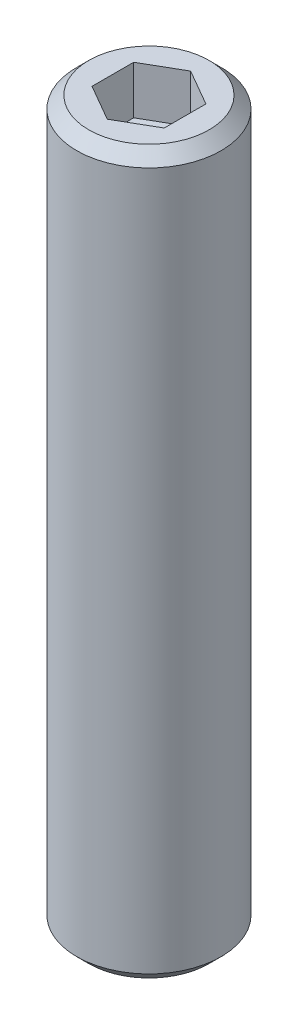
ISO-10303-21;
HEADER;
FILE_DESCRIPTION(('STEP AP214'),'2;1');
FILE_NAME('part.step','',(''),(''),'','','');
FILE_SCHEMA(('AUTOMOTIVE_DESIGN { 1 0 10303 214 1 1 1 1 }'));
ENDSEC;
DATA;
#1=APPLICATION_CONTEXT('core data for automotive mechanical design processes');
#2=APPLICATION_PROTOCOL_DEFINITION('international standard','automotive_design',2000,#1);
#3=PRODUCT_CONTEXT('',#1,'mechanical');
#4=PRODUCT('Part','Part','',(#3));
#5=PRODUCT_RELATED_PRODUCT_CATEGORY('part','',(#4));
#6=PRODUCT_DEFINITION_FORMATION('','',#4);
#7=PRODUCT_DEFINITION_CONTEXT('part definition',#1,'design');
#8=PRODUCT_DEFINITION('design','',#6,#7);
#9=PRODUCT_DEFINITION_SHAPE('','',#8);
#10=(LENGTH_UNIT() NAMED_UNIT(*) SI_UNIT(.MILLI.,.METRE.));
#11=(NAMED_UNIT(*) PLANE_ANGLE_UNIT() SI_UNIT($,.RADIAN.));
#12=(NAMED_UNIT(*) SI_UNIT($,.STERADIAN.) SOLID_ANGLE_UNIT());
#13=UNCERTAINTY_MEASURE_WITH_UNIT(LENGTH_MEASURE(1.E-05),#10,'distance_accuracy_value','');
#14=(GEOMETRIC_REPRESENTATION_CONTEXT(3) GLOBAL_UNCERTAINTY_ASSIGNED_CONTEXT((#13)) GLOBAL_UNIT_ASSIGNED_CONTEXT((#10,
#11,#12)) REPRESENTATION_CONTEXT('',''));
#15=CARTESIAN_POINT('',(0.,0.,0.));
#16=DIRECTION('',(0.,0.,1.));
#17=DIRECTION('',(1.,0.,0.));
#18=AXIS2_PLACEMENT_3D('',#15,#16,#17);
#19=CARTESIAN_POINT('',(0.,-30.,0.));
#20=DIRECTION('',(0.,1.,0.));
#21=DIRECTION('',(0.,0.,1.));
#22=AXIS2_PLACEMENT_3D('',#19,#20,#21);
#23=CYLINDRICAL_SURFACE('',#22,3.);
#24=CARTESIAN_POINT('',(0.,-29.5,0.));
#25=DIRECTION('',(0.,1.,0.));
#26=DIRECTION('',(0.,0.,1.));
#27=AXIS2_PLACEMENT_3D('',#24,#25,#26);
#28=CIRCLE('',#27,3.);
#29=CARTESIAN_POINT('',(0.,-29.5,3.));
#30=VERTEX_POINT('',#29);
#31=EDGE_CURVE('E144',#30,#30,#28,.T.);
#32=ORIENTED_EDGE('',*,*,#31,.T.);
#33=EDGE_LOOP('',(#32));
#34=FACE_BOUND('',#33,.T.);
#35=CARTESIAN_POINT('',(0.,-0.500000000000007,0.));
#36=DIRECTION('',(0.,1.,0.));
#37=DIRECTION('',(0.,0.,1.));
#38=AXIS2_PLACEMENT_3D('',#35,#36,#37);
#39=CIRCLE('',#38,3.);
#40=CARTESIAN_POINT('',(0.,-0.500000000000007,3.));
#41=VERTEX_POINT('',#40);
#42=EDGE_CURVE('E136',#41,#41,#39,.F.);
#43=ORIENTED_EDGE('',*,*,#42,.T.);
#44=EDGE_LOOP('',(#43));
#45=FACE_BOUND('',#44,.T.);
#46=ADVANCED_FACE('F34',(#34,#45),#23,.T.);
#47=CARTESIAN_POINT('',(0.,-30.,0.));
#48=DIRECTION('',(0.,1.,0.));
#49=DIRECTION('',(0.,0.,1.));
#50=AXIS2_PLACEMENT_3D('',#47,#48,#49);
#51=PLANE('',#50);
#52=CARTESIAN_POINT('',(0.,-30.,0.));
#53=DIRECTION('',(0.,1.,0.));
#54=DIRECTION('',(0.,0.,1.));
#55=AXIS2_PLACEMENT_3D('',#52,#53,#54);
#56=CIRCLE('',#55,2.49999999999999);
#57=CARTESIAN_POINT('',(0.,-30.,2.49999999999999));
#58=VERTEX_POINT('',#57);
#59=EDGE_CURVE('E42',#58,#58,#56,.F.);
#60=ORIENTED_EDGE('',*,*,#59,.T.);
#61=EDGE_LOOP('',(#60));
#62=FACE_BOUND('',#61,.T.);
#63=ADVANCED_FACE('F149',(#62),#51,.F.);
#64=CARTESIAN_POINT('',(0.,0.,0.));
#65=DIRECTION('',(0.,1.,0.));
#66=DIRECTION('',(0.,0.,1.));
#67=AXIS2_PLACEMENT_3D('',#64,#65,#66);
#68=PLANE('',#67);
#69=CARTESIAN_POINT('',(0.,0.,0.));
#70=DIRECTION('',(0.,1.,0.));
#71=DIRECTION('',(0.,0.,1.));
#72=AXIS2_PLACEMENT_3D('',#69,#70,#71);
#73=CIRCLE('',#72,2.5);
#74=CARTESIAN_POINT('',(0.,0.,2.5));
#75=VERTEX_POINT('',#74);
#76=EDGE_CURVE('E11',#75,#75,#73,.T.);
#77=ORIENTED_EDGE('',*,*,#76,.T.);
#78=EDGE_LOOP('',(#77));
#79=FACE_BOUND('',#78,.T.);
#80=DIRECTION('',(-0.866025403784439,0.,-0.5));
#81=VECTOR('',#80,1.);
#82=CARTESIAN_POINT('',(1.5,0.,-0.86602540378444));
#83=LINE('',#82,#81);
#84=CARTESIAN_POINT('',(1.5,0.,-0.86602540378444));
#85=VERTEX_POINT('',#84);
#86=CARTESIAN_POINT('',(0.,0.,-1.73205080756888));
#87=VERTEX_POINT('',#86);
#88=EDGE_CURVE('E49',#85,#87,#83,.T.);
#89=ORIENTED_EDGE('',*,*,#88,.F.);
#90=DIRECTION('',(0.,0.,-1.));
#91=VECTOR('',#90,1.);
#92=CARTESIAN_POINT('',(1.5,0.,0.866025403784438));
#93=LINE('',#92,#91);
#94=CARTESIAN_POINT('',(1.5,0.,0.866025403784438));
#95=VERTEX_POINT('',#94);
#96=EDGE_CURVE('E132',#95,#85,#93,.T.);
#97=ORIENTED_EDGE('',*,*,#96,.F.);
#98=DIRECTION('',(0.866025403784439,0.,-0.5));
#99=VECTOR('',#98,1.);
#100=CARTESIAN_POINT('',(0.,0.,1.73205080756888));
#101=LINE('',#100,#99);
#102=CARTESIAN_POINT('',(0.,0.,1.73205080756888));
#103=VERTEX_POINT('',#102);
#104=EDGE_CURVE('E130',#103,#95,#101,.T.);
#105=ORIENTED_EDGE('',*,*,#104,.F.);
#106=DIRECTION('',(0.866025403784439,0.,0.5));
#107=VECTOR('',#106,1.);
#108=CARTESIAN_POINT('',(-1.5,0.,0.866025403784439));
#109=LINE('',#108,#107);
#110=CARTESIAN_POINT('',(-1.5,0.,0.866025403784439));
#111=VERTEX_POINT('',#110);
#112=EDGE_CURVE('E97',#111,#103,#109,.T.);
#113=ORIENTED_EDGE('',*,*,#112,.F.);
#114=DIRECTION('',(0.,0.,1.));
#115=VECTOR('',#114,1.);
#116=CARTESIAN_POINT('',(-1.5,0.,-0.866025403784439));
#117=LINE('',#116,#115);
#118=CARTESIAN_POINT('',(-1.5,0.,-0.866025403784439));
#119=VERTEX_POINT('',#118);
#120=EDGE_CURVE('E126',#119,#111,#117,.T.);
#121=ORIENTED_EDGE('',*,*,#120,.F.);
#122=DIRECTION('',(-0.866025403784438,0.,0.5));
#123=VECTOR('',#122,1.);
#124=CARTESIAN_POINT('',(0.,0.,-1.73205080756888));
#125=LINE('',#124,#123);
#126=EDGE_CURVE('E123',#87,#119,#125,.T.);
#127=ORIENTED_EDGE('',*,*,#126,.F.);
#128=EDGE_LOOP('',(#89,#97,#105,#113,#121,#127));
#129=FACE_BOUND('',#128,.T.);
#130=ADVANCED_FACE('F165',(#79,#129),#68,.T.);
#131=CARTESIAN_POINT('',(1.5,-2.,-0.86602540378444));
#132=DIRECTION('',(0.5,0.,-0.866025403784439));
#133=DIRECTION('',(-0.866025403784439,0.,-0.5));
#134=AXIS2_PLACEMENT_3D('',#131,#132,#133);
#135=PLANE('',#134);
#136=ORIENTED_EDGE('',*,*,#88,.T.);
#137=DIRECTION('',(0.,1.,0.));
#138=VECTOR('',#137,1.);
#139=CARTESIAN_POINT('',(0.,-2.,-1.73205080756888));
#140=LINE('',#139,#138);
#141=CARTESIAN_POINT('',(0.,-2.,-1.73205080756888));
#142=VERTEX_POINT('',#141);
#143=EDGE_CURVE('E79',#142,#87,#140,.T.);
#144=ORIENTED_EDGE('',*,*,#143,.F.);
#145=DIRECTION('',(-0.866025403784439,0.,-0.5));
#146=VECTOR('',#145,1.);
#147=CARTESIAN_POINT('',(1.5,-2.,-0.86602540378444));
#148=LINE('',#147,#146);
#149=CARTESIAN_POINT('',(1.5,-2.,-0.86602540378444));
#150=VERTEX_POINT('',#149);
#151=EDGE_CURVE('E134',#150,#142,#148,.T.);
#152=ORIENTED_EDGE('',*,*,#151,.F.);
#153=DIRECTION('',(0.,1.,0.));
#154=VECTOR('',#153,1.);
#155=CARTESIAN_POINT('',(1.5,-2.,-0.86602540378444));
#156=LINE('',#155,#154);
#157=EDGE_CURVE('E57',#150,#85,#156,.T.);
#158=ORIENTED_EDGE('',*,*,#157,.T.);
#159=EDGE_LOOP('',(#136,#144,#152,#158));
#160=FACE_BOUND('',#159,.T.);
#161=ADVANCED_FACE('F168',(#160),#135,.F.);
#162=CARTESIAN_POINT('',(1.5,-2.,0.866025403784438));
#163=DIRECTION('',(1.,0.,0.));
#164=DIRECTION('',(0.,0.,-1.));
#165=AXIS2_PLACEMENT_3D('',#162,#163,#164);
#166=PLANE('',#165);
#167=ORIENTED_EDGE('',*,*,#96,.T.);
#168=ORIENTED_EDGE('',*,*,#157,.F.);
#169=DIRECTION('',(0.,0.,-1.));
#170=VECTOR('',#169,1.);
#171=CARTESIAN_POINT('',(1.5,-2.,0.866025403784438));
#172=LINE('',#171,#170);
#173=CARTESIAN_POINT('',(1.5,-2.,0.866025403784438));
#174=VERTEX_POINT('',#173);
#175=EDGE_CURVE('E109',#174,#150,#172,.T.);
#176=ORIENTED_EDGE('',*,*,#175,.F.);
#177=DIRECTION('',(0.,1.,0.));
#178=VECTOR('',#177,1.);
#179=CARTESIAN_POINT('',(1.5,-2.,0.866025403784438));
#180=LINE('',#179,#178);
#181=EDGE_CURVE('E101',#174,#95,#180,.T.);
#182=ORIENTED_EDGE('',*,*,#181,.T.);
#183=EDGE_LOOP('',(#167,#168,#176,#182));
#184=FACE_BOUND('',#183,.T.);
#185=ADVANCED_FACE('F177',(#184),#166,.F.);
#186=CARTESIAN_POINT('',(0.,-2.,1.73205080756888));
#187=DIRECTION('',(0.5,0.,0.866025403784439));
#188=DIRECTION('',(0.866025403784439,0.,-0.5));
#189=AXIS2_PLACEMENT_3D('',#186,#187,#188);
#190=PLANE('',#189);
#191=ORIENTED_EDGE('',*,*,#104,.T.);
#192=ORIENTED_EDGE('',*,*,#181,.F.);
#193=DIRECTION('',(0.866025403784439,0.,-0.5));
#194=VECTOR('',#193,1.);
#195=CARTESIAN_POINT('',(0.,-2.,1.73205080756888));
#196=LINE('',#195,#194);
#197=CARTESIAN_POINT('',(0.,-2.,1.73205080756888));
#198=VERTEX_POINT('',#197);
#199=EDGE_CURVE('E105',#198,#174,#196,.T.);
#200=ORIENTED_EDGE('',*,*,#199,.F.);
#201=DIRECTION('',(0.,1.,0.));
#202=VECTOR('',#201,1.);
#203=CARTESIAN_POINT('',(0.,-2.,1.73205080756888));
#204=LINE('',#203,#202);
#205=EDGE_CURVE('E90',#198,#103,#204,.T.);
#206=ORIENTED_EDGE('',*,*,#205,.T.);
#207=EDGE_LOOP('',(#191,#192,#200,#206));
#208=FACE_BOUND('',#207,.T.);
#209=ADVANCED_FACE('F106',(#208),#190,.F.);
#210=CARTESIAN_POINT('',(-1.5,-2.,0.866025403784439));
#211=DIRECTION('',(-0.5,0.,0.866025403784439));
#212=DIRECTION('',(0.866025403784439,0.,0.5));
#213=AXIS2_PLACEMENT_3D('',#210,#211,#212);
#214=PLANE('',#213);
#215=ORIENTED_EDGE('',*,*,#112,.T.);
#216=ORIENTED_EDGE('',*,*,#205,.F.);
#217=DIRECTION('',(0.866025403784439,0.,0.5));
#218=VECTOR('',#217,1.);
#219=CARTESIAN_POINT('',(-1.5,-2.,0.866025403784439));
#220=LINE('',#219,#218);
#221=CARTESIAN_POINT('',(-1.5,-2.,0.866025403784439));
#222=VERTEX_POINT('',#221);
#223=EDGE_CURVE('E94',#222,#198,#220,.T.);
#224=ORIENTED_EDGE('',*,*,#223,.F.);
#225=DIRECTION('',(0.,1.,0.));
#226=VECTOR('',#225,1.);
#227=CARTESIAN_POINT('',(-1.5,-2.,0.866025403784439));
#228=LINE('',#227,#226);
#229=EDGE_CURVE('E102',#222,#111,#228,.T.);
#230=ORIENTED_EDGE('',*,*,#229,.T.);
#231=EDGE_LOOP('',(#215,#216,#224,#230));
#232=FACE_BOUND('',#231,.T.);
#233=ADVANCED_FACE('F92',(#232),#214,.F.);
#234=CARTESIAN_POINT('',(-1.5,-2.,-0.866025403784439));
#235=DIRECTION('',(-1.,0.,0.));
#236=DIRECTION('',(0.,0.,1.));
#237=AXIS2_PLACEMENT_3D('',#234,#235,#236);
#238=PLANE('',#237);
#239=ORIENTED_EDGE('',*,*,#120,.T.);
#240=ORIENTED_EDGE('',*,*,#229,.F.);
#241=DIRECTION('',(0.,0.,1.));
#242=VECTOR('',#241,1.);
#243=CARTESIAN_POINT('',(-1.5,-2.,-0.866025403784439));
#244=LINE('',#243,#242);
#245=CARTESIAN_POINT('',(-1.5,-2.,-0.866025403784439));
#246=VERTEX_POINT('',#245);
#247=EDGE_CURVE('E115',#246,#222,#244,.T.);
#248=ORIENTED_EDGE('',*,*,#247,.F.);
#249=DIRECTION('',(0.,1.,0.));
#250=VECTOR('',#249,1.);
#251=CARTESIAN_POINT('',(-1.5,-2.,-0.866025403784439));
#252=LINE('',#251,#250);
#253=EDGE_CURVE('E139',#246,#119,#252,.T.);
#254=ORIENTED_EDGE('',*,*,#253,.T.);
#255=EDGE_LOOP('',(#239,#240,#248,#254));
#256=FACE_BOUND('',#255,.T.);
#257=ADVANCED_FACE('F222',(#256),#238,.F.);
#258=CARTESIAN_POINT('',(0.,-2.,-1.73205080756888));
#259=DIRECTION('',(-0.5,0.,-0.866025403784439));
#260=DIRECTION('',(-0.866025403784438,0.,0.5));
#261=AXIS2_PLACEMENT_3D('',#258,#259,#260);
#262=PLANE('',#261);
#263=ORIENTED_EDGE('',*,*,#126,.T.);
#264=ORIENTED_EDGE('',*,*,#253,.F.);
#265=DIRECTION('',(-0.866025403784438,0.,0.5));
#266=VECTOR('',#265,1.);
#267=CARTESIAN_POINT('',(0.,-2.,-1.73205080756888));
#268=LINE('',#267,#266);
#269=EDGE_CURVE('E117',#142,#246,#268,.T.);
#270=ORIENTED_EDGE('',*,*,#269,.F.);
#271=ORIENTED_EDGE('',*,*,#143,.T.);
#272=EDGE_LOOP('',(#263,#264,#270,#271));
#273=FACE_BOUND('',#272,.T.);
#274=ADVANCED_FACE('F174',(#273),#262,.F.);
#275=CARTESIAN_POINT('',(0.,-2.,0.));
#276=DIRECTION('',(0.,1.,0.));
#277=DIRECTION('',(0.,0.,1.));
#278=AXIS2_PLACEMENT_3D('',#275,#276,#277);
#279=PLANE('',#278);
#280=ORIENTED_EDGE('',*,*,#151,.T.);
#281=ORIENTED_EDGE('',*,*,#269,.T.);
#282=ORIENTED_EDGE('',*,*,#247,.T.);
#283=ORIENTED_EDGE('',*,*,#223,.T.);
#284=ORIENTED_EDGE('',*,*,#199,.T.);
#285=ORIENTED_EDGE('',*,*,#175,.T.);
#286=EDGE_LOOP('',(#280,#281,#282,#283,#284,#285));
#287=FACE_BOUND('',#286,.T.);
#288=ADVANCED_FACE('F112',(#287),#279,.T.);
#289=CARTESIAN_POINT('',(0.,-29.5,0.));
#290=DIRECTION('',(0.,1.,0.));
#291=DIRECTION('',(0.,0.,1.));
#292=AXIS2_PLACEMENT_3D('',#289,#290,#291);
#293=CONICAL_SURFACE('',#292,3.,0.785398163397456);
#294=ORIENTED_EDGE('',*,*,#59,.F.);
#295=EDGE_LOOP('',(#294));
#296=FACE_BOUND('',#295,.T.);
#297=ORIENTED_EDGE('',*,*,#31,.F.);
#298=EDGE_LOOP('',(#297));
#299=FACE_BOUND('',#298,.T.);
#300=ADVANCED_FACE('F151',(#296,#299),#293,.T.);
#301=CARTESIAN_POINT('',(0.,0.,0.));
#302=DIRECTION('',(0.,-1.,0.));
#303=DIRECTION('',(0.,0.,-1.));
#304=AXIS2_PLACEMENT_3D('',#301,#302,#303);
#305=CONICAL_SURFACE('',#304,2.5,0.785398163397442);
#306=ORIENTED_EDGE('',*,*,#42,.F.);
#307=EDGE_LOOP('',(#306));
#308=FACE_BOUND('',#307,.T.);
#309=ORIENTED_EDGE('',*,*,#76,.F.);
#310=EDGE_LOOP('',(#309));
#311=FACE_BOUND('',#310,.T.);
#312=ADVANCED_FACE('F36',(#308,#311),#305,.T.);
#313=CLOSED_SHELL('',(#46,#63,#130,#161,#185,#209,#233,#257,#274,#288,#300,#312));
#314=MANIFOLD_SOLID_BREP('B2',#313);
#315=ADVANCED_BREP_SHAPE_REPRESENTATION('',(#18,#314),#14);
#316=SHAPE_DEFINITION_REPRESENTATION(#9,#315);
ENDSEC;
END-ISO-10303-21;
